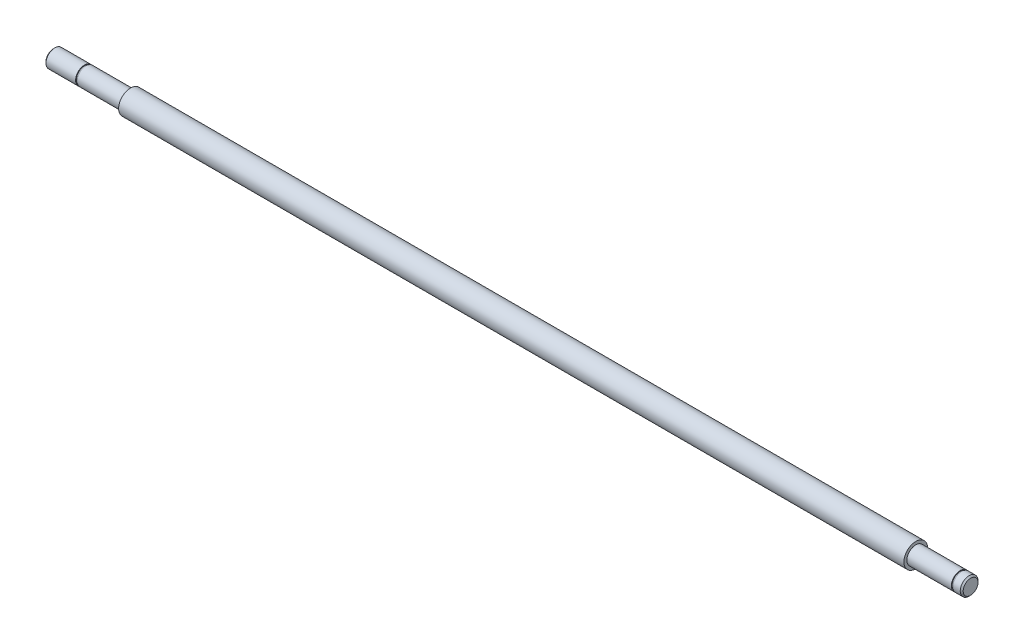
ISO-10303-21;
HEADER;
FILE_DESCRIPTION(('STEP AP214'),'2;1');
FILE_NAME('part.step','',(''),(''),'','','');
FILE_SCHEMA(('AUTOMOTIVE_DESIGN { 1 0 10303 214 1 1 1 1 }'));
ENDSEC;
DATA;
#1=APPLICATION_CONTEXT('core data for automotive mechanical design processes');
#2=APPLICATION_PROTOCOL_DEFINITION('international standard','automotive_design',2000,#1);
#3=PRODUCT_CONTEXT('',#1,'mechanical');
#4=PRODUCT('Part','Part','',(#3));
#5=PRODUCT_RELATED_PRODUCT_CATEGORY('part','',(#4));
#6=PRODUCT_DEFINITION_FORMATION('','',#4);
#7=PRODUCT_DEFINITION_CONTEXT('part definition',#1,'design');
#8=PRODUCT_DEFINITION('design','',#6,#7);
#9=PRODUCT_DEFINITION_SHAPE('','',#8);
#10=(LENGTH_UNIT() NAMED_UNIT(*) SI_UNIT(.MILLI.,.METRE.));
#11=(NAMED_UNIT(*) PLANE_ANGLE_UNIT() SI_UNIT($,.RADIAN.));
#12=(NAMED_UNIT(*) SI_UNIT($,.STERADIAN.) SOLID_ANGLE_UNIT());
#13=UNCERTAINTY_MEASURE_WITH_UNIT(LENGTH_MEASURE(1.E-05),#10,'distance_accuracy_value','');
#14=(GEOMETRIC_REPRESENTATION_CONTEXT(3) GLOBAL_UNCERTAINTY_ASSIGNED_CONTEXT((#13)) GLOBAL_UNIT_ASSIGNED_CONTEXT((#10,
#11,#12)) REPRESENTATION_CONTEXT('',''));
#15=CARTESIAN_POINT('',(0.,0.,0.));
#16=DIRECTION('',(0.,0.,1.));
#17=DIRECTION('',(1.,0.,0.));
#18=AXIS2_PLACEMENT_3D('',#15,#16,#17);
#19=CARTESIAN_POINT('',(132.5,4.00000000000003,0.));
#20=DIRECTION('',(-1.,0.,0.));
#21=DIRECTION('',(0.,0.,1.));
#22=AXIS2_PLACEMENT_3D('',#19,#20,#21);
#23=PLANE('',#22);
#24=CARTESIAN_POINT('',(132.5,0.,0.));
#25=DIRECTION('',(-1.,0.,0.));
#26=DIRECTION('',(0.,0.,1.));
#27=AXIS2_PLACEMENT_3D('',#24,#25,#26);
#28=CIRCLE('',#27,4.00000000000003);
#29=CARTESIAN_POINT('',(132.5,0.,4.00000000000003));
#30=VERTEX_POINT('',#29);
#31=EDGE_CURVE('E62',#30,#30,#28,.T.);
#32=ORIENTED_EDGE('',*,*,#31,.F.);
#33=EDGE_LOOP('',(#32));
#34=FACE_BOUND('',#33,.T.);
#35=CARTESIAN_POINT('',(132.5,0.,0.));
#36=DIRECTION('',(-1.,0.,0.));
#37=DIRECTION('',(0.,0.,1.));
#38=AXIS2_PLACEMENT_3D('',#35,#36,#37);
#39=CIRCLE('',#38,3.);
#40=CARTESIAN_POINT('',(132.5,0.,3.));
#41=VERTEX_POINT('',#40);
#42=EDGE_CURVE('E95',#41,#41,#39,.T.);
#43=ORIENTED_EDGE('',*,*,#42,.T.);
#44=EDGE_LOOP('',(#43));
#45=FACE_BOUND('',#44,.T.);
#46=ADVANCED_FACE('F41',(#34,#45),#23,.F.);
#47=CARTESIAN_POINT('',(0.,0.,0.));
#48=DIRECTION('',(-1.,0.,0.));
#49=DIRECTION('',(0.,0.,1.));
#50=AXIS2_PLACEMENT_3D('',#47,#48,#49);
#51=CYLINDRICAL_SURFACE('',#50,4.00000000000001);
#52=CARTESIAN_POINT('',(-132.5,0.,0.));
#53=DIRECTION('',(-1.,0.,0.));
#54=DIRECTION('',(0.,0.,1.));
#55=AXIS2_PLACEMENT_3D('',#52,#53,#54);
#56=CIRCLE('',#55,4.);
#57=CARTESIAN_POINT('',(-132.5,0.,4.));
#58=VERTEX_POINT('',#57);
#59=EDGE_CURVE('E65',#58,#58,#56,.T.);
#60=ORIENTED_EDGE('',*,*,#59,.F.);
#61=EDGE_LOOP('',(#60));
#62=FACE_BOUND('',#61,.T.);
#63=ORIENTED_EDGE('',*,*,#31,.T.);
#64=EDGE_LOOP('',(#63));
#65=FACE_BOUND('',#64,.T.);
#66=ADVANCED_FACE('F138',(#62,#65),#51,.T.);
#67=CARTESIAN_POINT('',(-132.5,4.,0.));
#68=DIRECTION('',(1.,0.,0.));
#69=DIRECTION('',(0.,0.,-1.));
#70=AXIS2_PLACEMENT_3D('',#67,#68,#69);
#71=PLANE('',#70);
#72=CARTESIAN_POINT('',(-132.5,0.,0.));
#73=DIRECTION('',(-1.,0.,0.));
#74=DIRECTION('',(0.,0.,1.));
#75=AXIS2_PLACEMENT_3D('',#72,#73,#74);
#76=CIRCLE('',#75,2.99999999999997);
#77=CARTESIAN_POINT('',(-132.5,0.,2.99999999999997));
#78=VERTEX_POINT('',#77);
#79=EDGE_CURVE('E68',#78,#78,#76,.T.);
#80=ORIENTED_EDGE('',*,*,#79,.F.);
#81=EDGE_LOOP('',(#80));
#82=FACE_BOUND('',#81,.T.);
#83=ORIENTED_EDGE('',*,*,#59,.T.);
#84=EDGE_LOOP('',(#83));
#85=FACE_BOUND('',#84,.T.);
#86=ADVANCED_FACE('F144',(#82,#85),#71,.F.);
#87=CARTESIAN_POINT('',(0.,0.,0.));
#88=DIRECTION('',(-1.,0.,0.));
#89=DIRECTION('',(0.,0.,1.));
#90=AXIS2_PLACEMENT_3D('',#87,#88,#89);
#91=CYLINDRICAL_SURFACE('',#90,2.99999999999997);
#92=CARTESIAN_POINT('',(-147.5,0.,0.));
#93=DIRECTION('',(-1.,0.,0.));
#94=DIRECTION('',(0.,0.,1.));
#95=AXIS2_PLACEMENT_3D('',#92,#93,#94);
#96=CIRCLE('',#95,2.99999999999996);
#97=CARTESIAN_POINT('',(-147.5,0.,2.99999999999996));
#98=VERTEX_POINT('',#97);
#99=EDGE_CURVE('E71',#98,#98,#96,.T.);
#100=ORIENTED_EDGE('',*,*,#99,.F.);
#101=EDGE_LOOP('',(#100));
#102=FACE_BOUND('',#101,.T.);
#103=ORIENTED_EDGE('',*,*,#79,.T.);
#104=EDGE_LOOP('',(#103));
#105=FACE_BOUND('',#104,.T.);
#106=ADVANCED_FACE('F224',(#102,#105),#91,.T.);
#107=CARTESIAN_POINT('',(-147.5,2.99999999999996,0.));
#108=DIRECTION('',(1.,0.,0.));
#109=DIRECTION('',(0.,0.,-1.));
#110=AXIS2_PLACEMENT_3D('',#107,#108,#109);
#111=PLANE('',#110);
#112=CARTESIAN_POINT('',(-147.5,0.,0.));
#113=DIRECTION('',(-1.,0.,0.));
#114=DIRECTION('',(0.,0.,1.));
#115=AXIS2_PLACEMENT_3D('',#112,#113,#114);
#116=CIRCLE('',#115,2.74999999999996);
#117=CARTESIAN_POINT('',(-147.5,0.,2.74999999999996));
#118=VERTEX_POINT('',#117);
#119=EDGE_CURVE('E74',#118,#118,#116,.T.);
#120=ORIENTED_EDGE('',*,*,#119,.F.);
#121=EDGE_LOOP('',(#120));
#122=FACE_BOUND('',#121,.T.);
#123=ORIENTED_EDGE('',*,*,#99,.T.);
#124=EDGE_LOOP('',(#123));
#125=FACE_BOUND('',#124,.T.);
#126=ADVANCED_FACE('F216',(#122,#125),#111,.F.);
#127=CARTESIAN_POINT('',(0.,0.,0.));
#128=DIRECTION('',(-1.,0.,0.));
#129=DIRECTION('',(0.,0.,1.));
#130=AXIS2_PLACEMENT_3D('',#127,#128,#129);
#131=CYLINDRICAL_SURFACE('',#130,2.74999999999996);
#132=CARTESIAN_POINT('',(-148.,0.,0.));
#133=DIRECTION('',(-1.,0.,0.));
#134=DIRECTION('',(0.,0.,1.));
#135=AXIS2_PLACEMENT_3D('',#132,#133,#134);
#136=CIRCLE('',#135,2.74999999999996);
#137=CARTESIAN_POINT('',(-148.,0.,2.74999999999996));
#138=VERTEX_POINT('',#137);
#139=EDGE_CURVE('E77',#138,#138,#136,.T.);
#140=ORIENTED_EDGE('',*,*,#139,.F.);
#141=EDGE_LOOP('',(#140));
#142=FACE_BOUND('',#141,.T.);
#143=ORIENTED_EDGE('',*,*,#119,.T.);
#144=EDGE_LOOP('',(#143));
#145=FACE_BOUND('',#144,.T.);
#146=ADVANCED_FACE('F208',(#142,#145),#131,.T.);
#147=CARTESIAN_POINT('',(-148.,2.74999999999996,0.));
#148=DIRECTION('',(-1.,0.,0.));
#149=DIRECTION('',(0.,0.,1.));
#150=AXIS2_PLACEMENT_3D('',#147,#148,#149);
#151=PLANE('',#150);
#152=CARTESIAN_POINT('',(-148.,0.,0.));
#153=DIRECTION('',(-1.,0.,0.));
#154=DIRECTION('',(0.,0.,1.));
#155=AXIS2_PLACEMENT_3D('',#152,#153,#154);
#156=CIRCLE('',#155,3.);
#157=CARTESIAN_POINT('',(-148.,0.,3.));
#158=VERTEX_POINT('',#157);
#159=EDGE_CURVE('E80',#158,#158,#156,.T.);
#160=ORIENTED_EDGE('',*,*,#159,.F.);
#161=EDGE_LOOP('',(#160));
#162=FACE_BOUND('',#161,.T.);
#163=ORIENTED_EDGE('',*,*,#139,.T.);
#164=EDGE_LOOP('',(#163));
#165=FACE_BOUND('',#164,.T.);
#166=ADVANCED_FACE('F202',(#162,#165),#151,.F.);
#167=CARTESIAN_POINT('',(0.,0.,0.));
#168=DIRECTION('',(-1.,0.,0.));
#169=DIRECTION('',(0.,0.,1.));
#170=AXIS2_PLACEMENT_3D('',#167,#168,#169);
#171=CYLINDRICAL_SURFACE('',#170,3.);
#172=CARTESIAN_POINT('',(-158.,0.,0.));
#173=DIRECTION('',(1.,0.,0.));
#174=DIRECTION('',(0.,0.,-1.));
#175=AXIS2_PLACEMENT_3D('',#172,#173,#174);
#176=CIRCLE('',#175,3.);
#177=CARTESIAN_POINT('',(-158.,0.,-3.));
#178=VERTEX_POINT('',#177);
#179=EDGE_CURVE('E10',#178,#178,#176,.T.);
#180=ORIENTED_EDGE('',*,*,#179,.T.);
#181=EDGE_LOOP('',(#180));
#182=FACE_BOUND('',#181,.T.);
#183=ORIENTED_EDGE('',*,*,#159,.T.);
#184=EDGE_LOOP('',(#183));
#185=FACE_BOUND('',#184,.T.);
#186=ADVANCED_FACE('F196',(#182,#185),#171,.T.);
#187=CARTESIAN_POINT('',(-158.5,3.,0.));
#188=DIRECTION('',(1.,0.,0.));
#189=DIRECTION('',(0.,0.,-1.));
#190=AXIS2_PLACEMENT_3D('',#187,#188,#189);
#191=PLANE('',#190);
#192=CARTESIAN_POINT('',(-158.5,0.,0.));
#193=DIRECTION('',(1.,0.,0.));
#194=DIRECTION('',(0.,0.,-1.));
#195=AXIS2_PLACEMENT_3D('',#192,#193,#194);
#196=CIRCLE('',#195,2.5);
#197=CARTESIAN_POINT('',(-158.5,0.,-2.5));
#198=VERTEX_POINT('',#197);
#199=EDGE_CURVE('E49',#198,#198,#196,.F.);
#200=ORIENTED_EDGE('',*,*,#199,.T.);
#201=EDGE_LOOP('',(#200));
#202=FACE_BOUND('',#201,.T.);
#203=ADVANCED_FACE('F134',(#202),#191,.F.);
#204=CARTESIAN_POINT('',(151.,3.,0.));
#205=DIRECTION('',(-1.,0.,0.));
#206=DIRECTION('',(0.,0.,1.));
#207=AXIS2_PLACEMENT_3D('',#204,#205,#206);
#208=PLANE('',#207);
#209=CARTESIAN_POINT('',(151.,0.,0.));
#210=DIRECTION('',(-1.,0.,0.));
#211=DIRECTION('',(0.,0.,1.));
#212=AXIS2_PLACEMENT_3D('',#209,#210,#211);
#213=CIRCLE('',#212,2.50000000000009);
#214=CARTESIAN_POINT('',(151.,0.,2.50000000000009));
#215=VERTEX_POINT('',#214);
#216=EDGE_CURVE('E53',#215,#215,#213,.F.);
#217=ORIENTED_EDGE('',*,*,#216,.T.);
#218=EDGE_LOOP('',(#217));
#219=FACE_BOUND('',#218,.T.);
#220=ADVANCED_FACE('F127',(#219),#208,.F.);
#221=CARTESIAN_POINT('',(0.,0.,0.));
#222=DIRECTION('',(-1.,0.,0.));
#223=DIRECTION('',(0.,0.,1.));
#224=AXIS2_PLACEMENT_3D('',#221,#222,#223);
#225=CYLINDRICAL_SURFACE('',#224,3.00000000000002);
#226=CARTESIAN_POINT('',(150.5,0.,0.));
#227=DIRECTION('',(-1.,0.,0.));
#228=DIRECTION('',(0.,0.,1.));
#229=AXIS2_PLACEMENT_3D('',#226,#227,#228);
#230=CIRCLE('',#229,3.00000000000002);
#231=CARTESIAN_POINT('',(150.5,0.,3.00000000000002));
#232=VERTEX_POINT('',#231);
#233=EDGE_CURVE('E57',#232,#232,#230,.T.);
#234=ORIENTED_EDGE('',*,*,#233,.T.);
#235=EDGE_LOOP('',(#234));
#236=FACE_BOUND('',#235,.T.);
#237=CARTESIAN_POINT('',(148.,0.,0.));
#238=DIRECTION('',(-1.,0.,0.));
#239=DIRECTION('',(0.,0.,1.));
#240=AXIS2_PLACEMENT_3D('',#237,#238,#239);
#241=CIRCLE('',#240,3.00000000000003);
#242=CARTESIAN_POINT('',(148.,0.,3.00000000000003));
#243=VERTEX_POINT('',#242);
#244=EDGE_CURVE('E83',#243,#243,#241,.T.);
#245=ORIENTED_EDGE('',*,*,#244,.F.);
#246=EDGE_LOOP('',(#245));
#247=FACE_BOUND('',#246,.T.);
#248=ADVANCED_FACE('F122',(#236,#247),#225,.T.);
#249=CARTESIAN_POINT('',(148.,2.75,0.));
#250=DIRECTION('',(1.,0.,0.));
#251=DIRECTION('',(0.,0.,-1.));
#252=AXIS2_PLACEMENT_3D('',#249,#250,#251);
#253=PLANE('',#252);
#254=CARTESIAN_POINT('',(148.,0.,0.));
#255=DIRECTION('',(-1.,0.,0.));
#256=DIRECTION('',(0.,0.,1.));
#257=AXIS2_PLACEMENT_3D('',#254,#255,#256);
#258=CIRCLE('',#257,2.75);
#259=CARTESIAN_POINT('',(148.,0.,2.75));
#260=VERTEX_POINT('',#259);
#261=EDGE_CURVE('E86',#260,#260,#258,.T.);
#262=ORIENTED_EDGE('',*,*,#261,.F.);
#263=EDGE_LOOP('',(#262));
#264=FACE_BOUND('',#263,.T.);
#265=ORIENTED_EDGE('',*,*,#244,.T.);
#266=EDGE_LOOP('',(#265));
#267=FACE_BOUND('',#266,.T.);
#268=ADVANCED_FACE('F116',(#264,#267),#253,.F.);
#269=CARTESIAN_POINT('',(0.,0.,0.));
#270=DIRECTION('',(-1.,0.,0.));
#271=DIRECTION('',(0.,0.,1.));
#272=AXIS2_PLACEMENT_3D('',#269,#270,#271);
#273=CYLINDRICAL_SURFACE('',#272,2.75);
#274=CARTESIAN_POINT('',(147.5,0.,0.));
#275=DIRECTION('',(-1.,0.,0.));
#276=DIRECTION('',(0.,0.,1.));
#277=AXIS2_PLACEMENT_3D('',#274,#275,#276);
#278=CIRCLE('',#277,2.75);
#279=CARTESIAN_POINT('',(147.5,0.,2.75));
#280=VERTEX_POINT('',#279);
#281=EDGE_CURVE('E89',#280,#280,#278,.T.);
#282=ORIENTED_EDGE('',*,*,#281,.F.);
#283=EDGE_LOOP('',(#282));
#284=FACE_BOUND('',#283,.T.);
#285=ORIENTED_EDGE('',*,*,#261,.T.);
#286=EDGE_LOOP('',(#285));
#287=FACE_BOUND('',#286,.T.);
#288=ADVANCED_FACE('F110',(#284,#287),#273,.T.);
#289=CARTESIAN_POINT('',(147.5,3.,0.));
#290=DIRECTION('',(-1.,0.,0.));
#291=DIRECTION('',(0.,0.,1.));
#292=AXIS2_PLACEMENT_3D('',#289,#290,#291);
#293=PLANE('',#292);
#294=CARTESIAN_POINT('',(147.5,0.,0.));
#295=DIRECTION('',(-1.,0.,0.));
#296=DIRECTION('',(0.,0.,1.));
#297=AXIS2_PLACEMENT_3D('',#294,#295,#296);
#298=CIRCLE('',#297,3.);
#299=CARTESIAN_POINT('',(147.5,0.,3.));
#300=VERTEX_POINT('',#299);
#301=EDGE_CURVE('E92',#300,#300,#298,.T.);
#302=ORIENTED_EDGE('',*,*,#301,.F.);
#303=EDGE_LOOP('',(#302));
#304=FACE_BOUND('',#303,.T.);
#305=ORIENTED_EDGE('',*,*,#281,.T.);
#306=EDGE_LOOP('',(#305));
#307=FACE_BOUND('',#306,.T.);
#308=ADVANCED_FACE('F104',(#304,#307),#293,.F.);
#309=CARTESIAN_POINT('',(0.,0.,0.));
#310=DIRECTION('',(-1.,0.,0.));
#311=DIRECTION('',(0.,0.,1.));
#312=AXIS2_PLACEMENT_3D('',#309,#310,#311);
#313=CYLINDRICAL_SURFACE('',#312,3.);
#314=ORIENTED_EDGE('',*,*,#42,.F.);
#315=EDGE_LOOP('',(#314));
#316=FACE_BOUND('',#315,.T.);
#317=ORIENTED_EDGE('',*,*,#301,.T.);
#318=EDGE_LOOP('',(#317));
#319=FACE_BOUND('',#318,.T.);
#320=ADVANCED_FACE('F100',(#316,#319),#313,.T.);
#321=CARTESIAN_POINT('',(150.5,0.,0.));
#322=DIRECTION('',(-1.,0.,0.));
#323=DIRECTION('',(0.,0.,1.));
#324=AXIS2_PLACEMENT_3D('',#321,#322,#323);
#325=CONICAL_SURFACE('',#324,3.00000000000002,0.785398163397435);
#326=ORIENTED_EDGE('',*,*,#216,.F.);
#327=EDGE_LOOP('',(#326));
#328=FACE_BOUND('',#327,.T.);
#329=ORIENTED_EDGE('',*,*,#233,.F.);
#330=EDGE_LOOP('',(#329));
#331=FACE_BOUND('',#330,.T.);
#332=ADVANCED_FACE('F103',(#328,#331),#325,.T.);
#333=CARTESIAN_POINT('',(-158.5,0.,0.));
#334=DIRECTION('',(1.,0.,0.));
#335=DIRECTION('',(0.,0.,-1.));
#336=AXIS2_PLACEMENT_3D('',#333,#334,#335);
#337=CONICAL_SURFACE('',#336,2.5,0.785398163397444);
#338=ORIENTED_EDGE('',*,*,#179,.F.);
#339=EDGE_LOOP('',(#338));
#340=FACE_BOUND('',#339,.T.);
#341=ORIENTED_EDGE('',*,*,#199,.F.);
#342=EDGE_LOOP('',(#341));
#343=FACE_BOUND('',#342,.T.);
#344=ADVANCED_FACE('F44',(#340,#343),#337,.T.);
#345=CLOSED_SHELL('',(#46,#66,#86,#106,#126,#146,#166,#186,#203,#220,#248,#268,#288,#308,#320,
#332,#344));
#346=MANIFOLD_SOLID_BREP('B2',#345);
#347=ADVANCED_BREP_SHAPE_REPRESENTATION('',(#18,#346),#14);
#348=SHAPE_DEFINITION_REPRESENTATION(#9,#347);
ENDSEC;
END-ISO-10303-21;
